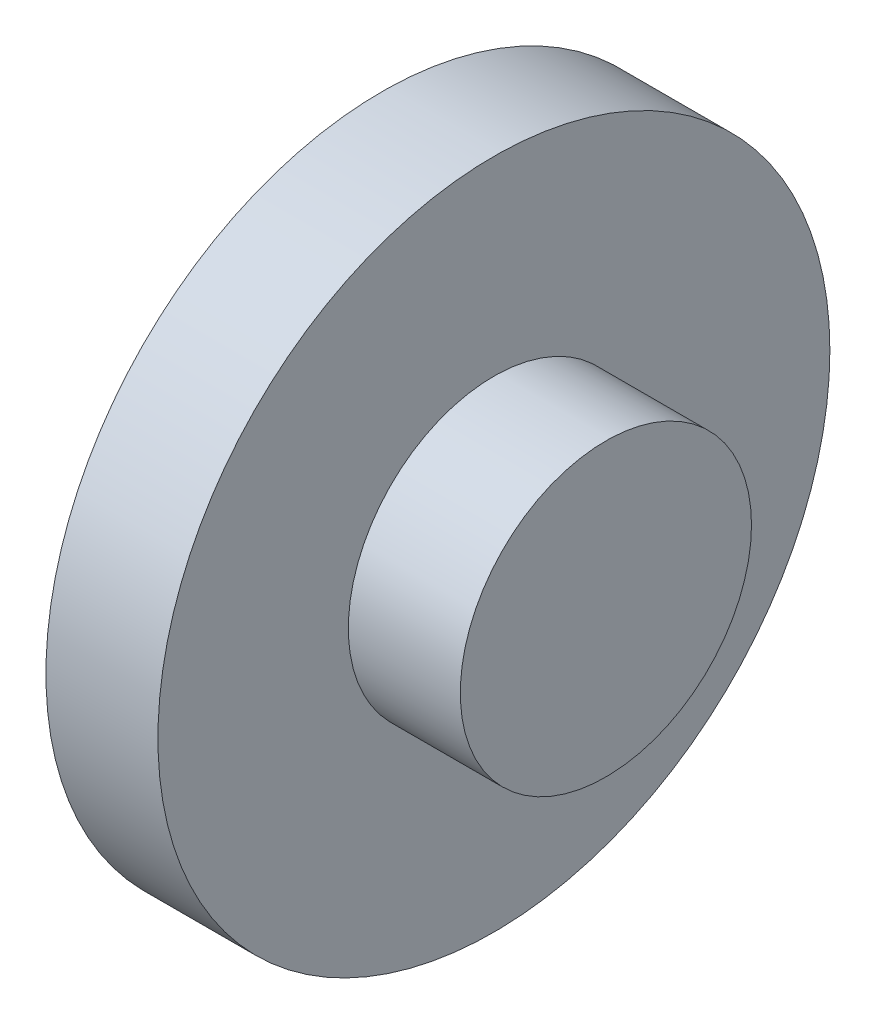
ISO-10303-21;
HEADER;
FILE_DESCRIPTION(('STEP AP214'),'2;1');
FILE_NAME('part.step','',(''),(''),'','','');
FILE_SCHEMA(('AUTOMOTIVE_DESIGN { 1 0 10303 214 1 1 1 1 }'));
ENDSEC;
DATA;
#1=APPLICATION_CONTEXT('core data for automotive mechanical design processes');
#2=APPLICATION_PROTOCOL_DEFINITION('international standard','automotive_design',2000,#1);
#3=PRODUCT_CONTEXT('',#1,'mechanical');
#4=PRODUCT('Part','Part','',(#3));
#5=PRODUCT_RELATED_PRODUCT_CATEGORY('part','',(#4));
#6=PRODUCT_DEFINITION_FORMATION('','',#4);
#7=PRODUCT_DEFINITION_CONTEXT('part definition',#1,'design');
#8=PRODUCT_DEFINITION('design','',#6,#7);
#9=PRODUCT_DEFINITION_SHAPE('','',#8);
#10=(LENGTH_UNIT() NAMED_UNIT(*) SI_UNIT(.MILLI.,.METRE.));
#11=(NAMED_UNIT(*) PLANE_ANGLE_UNIT() SI_UNIT($,.RADIAN.));
#12=(NAMED_UNIT(*) SI_UNIT($,.STERADIAN.) SOLID_ANGLE_UNIT());
#13=UNCERTAINTY_MEASURE_WITH_UNIT(LENGTH_MEASURE(1.E-05),#10,'distance_accuracy_value','');
#14=(GEOMETRIC_REPRESENTATION_CONTEXT(3) GLOBAL_UNCERTAINTY_ASSIGNED_CONTEXT((#13)) GLOBAL_UNIT_ASSIGNED_CONTEXT((#10,
#11,#12)) REPRESENTATION_CONTEXT('',''));
#15=CARTESIAN_POINT('',(0.,0.,0.));
#16=DIRECTION('',(0.,0.,1.));
#17=DIRECTION('',(1.,0.,0.));
#18=AXIS2_PLACEMENT_3D('',#15,#16,#17);
#19=CARTESIAN_POINT('',(10.,0.,0.));
#20=DIRECTION('',(-1.,0.,0.));
#21=DIRECTION('',(0.,0.,1.));
#22=AXIS2_PLACEMENT_3D('',#19,#20,#21);
#23=CYLINDRICAL_SURFACE('',#22,30.);
#24=CARTESIAN_POINT('',(10.,0.,0.));
#25=DIRECTION('',(1.,0.,0.));
#26=DIRECTION('',(0.,0.,-1.));
#27=AXIS2_PLACEMENT_3D('',#24,#25,#26);
#28=CIRCLE('',#27,30.);
#29=CARTESIAN_POINT('',(10.,0.,-30.));
#30=VERTEX_POINT('',#29);
#31=EDGE_CURVE('E45',#30,#30,#28,.T.);
#32=ORIENTED_EDGE('',*,*,#31,.F.);
#33=EDGE_LOOP('',(#32));
#34=FACE_BOUND('',#33,.T.);
#35=CARTESIAN_POINT('',(0.,0.,0.));
#36=DIRECTION('',(1.,0.,0.));
#37=DIRECTION('',(0.,0.,-1.));
#38=AXIS2_PLACEMENT_3D('',#35,#36,#37);
#39=CIRCLE('',#38,30.);
#40=CARTESIAN_POINT('',(0.,0.,-30.));
#41=VERTEX_POINT('',#40);
#42=EDGE_CURVE('E40',#41,#41,#39,.T.);
#43=ORIENTED_EDGE('',*,*,#42,.T.);
#44=EDGE_LOOP('',(#43));
#45=FACE_BOUND('',#44,.T.);
#46=ADVANCED_FACE('F37',(#34,#45),#23,.T.);
#47=CARTESIAN_POINT('',(10.,0.,0.));
#48=DIRECTION('',(1.,0.,0.));
#49=DIRECTION('',(0.,0.,-1.));
#50=AXIS2_PLACEMENT_3D('',#47,#48,#49);
#51=PLANE('',#50);
#52=CARTESIAN_POINT('',(10.,0.,0.));
#53=DIRECTION('',(1.,0.,0.));
#54=DIRECTION('',(0.,0.,-1.));
#55=AXIS2_PLACEMENT_3D('',#52,#53,#54);
#56=CIRCLE('',#55,13.);
#57=CARTESIAN_POINT('',(10.,0.,-13.));
#58=VERTEX_POINT('',#57);
#59=EDGE_CURVE('E10',#58,#58,#56,.T.);
#60=ORIENTED_EDGE('',*,*,#59,.F.);
#61=EDGE_LOOP('',(#60));
#62=FACE_BOUND('',#61,.T.);
#63=ORIENTED_EDGE('',*,*,#31,.T.);
#64=EDGE_LOOP('',(#63));
#65=FACE_BOUND('',#64,.T.);
#66=ADVANCED_FACE('F65',(#62,#65),#51,.T.);
#67=CARTESIAN_POINT('',(0.,0.,0.));
#68=DIRECTION('',(1.,0.,0.));
#69=DIRECTION('',(0.,0.,-1.));
#70=AXIS2_PLACEMENT_3D('',#67,#68,#69);
#71=PLANE('',#70);
#72=ORIENTED_EDGE('',*,*,#42,.F.);
#73=EDGE_LOOP('',(#72));
#74=FACE_BOUND('',#73,.T.);
#75=ADVANCED_FACE('F62',(#74),#71,.F.);
#76=CARTESIAN_POINT('',(20.,0.,0.));
#77=DIRECTION('',(-1.,0.,0.));
#78=DIRECTION('',(0.,0.,1.));
#79=AXIS2_PLACEMENT_3D('',#76,#77,#78);
#80=CYLINDRICAL_SURFACE('',#79,13.);
#81=CARTESIAN_POINT('',(20.,0.,0.));
#82=DIRECTION('',(1.,0.,0.));
#83=DIRECTION('',(0.,0.,-1.));
#84=AXIS2_PLACEMENT_3D('',#81,#82,#83);
#85=CIRCLE('',#84,13.);
#86=CARTESIAN_POINT('',(20.,0.,-13.));
#87=VERTEX_POINT('',#86);
#88=EDGE_CURVE('E52',#87,#87,#85,.T.);
#89=ORIENTED_EDGE('',*,*,#88,.F.);
#90=EDGE_LOOP('',(#89));
#91=FACE_BOUND('',#90,.T.);
#92=ORIENTED_EDGE('',*,*,#59,.T.);
#93=EDGE_LOOP('',(#92));
#94=FACE_BOUND('',#93,.T.);
#95=ADVANCED_FACE('F64',(#91,#94),#80,.T.);
#96=CARTESIAN_POINT('',(20.,0.,0.));
#97=DIRECTION('',(1.,0.,0.));
#98=DIRECTION('',(0.,0.,-1.));
#99=AXIS2_PLACEMENT_3D('',#96,#97,#98);
#100=PLANE('',#99);
#101=ORIENTED_EDGE('',*,*,#88,.T.);
#102=EDGE_LOOP('',(#101));
#103=FACE_BOUND('',#102,.T.);
#104=ADVANCED_FACE('F70',(#103),#100,.T.);
#105=CLOSED_SHELL('',(#46,#66,#75,#95,#104));
#106=MANIFOLD_SOLID_BREP('B2',#105);
#107=ADVANCED_BREP_SHAPE_REPRESENTATION('',(#18,#106),#14);
#108=SHAPE_DEFINITION_REPRESENTATION(#9,#107);
ENDSEC;
END-ISO-10303-21;
